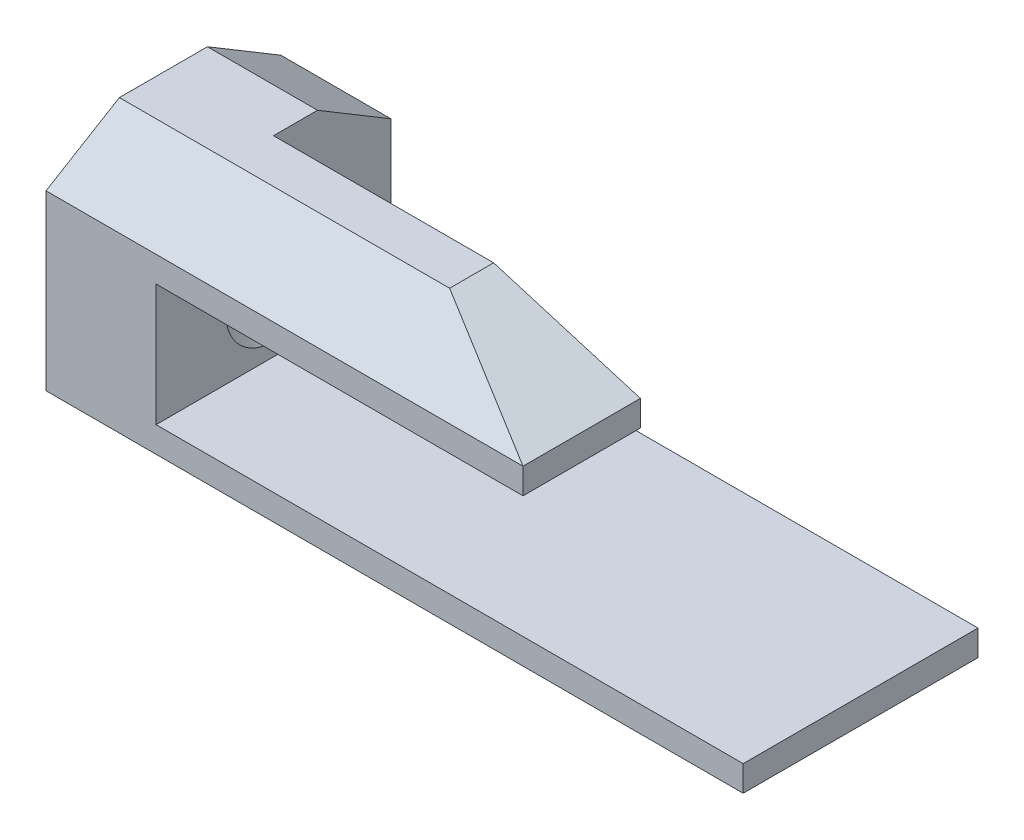
ISO-10303-21;
HEADER;
FILE_DESCRIPTION(('STEP AP214'),'2;1');
FILE_NAME('part.step','',(''),(''),'','','');
FILE_SCHEMA(('AUTOMOTIVE_DESIGN { 1 0 10303 214 1 1 1 1 }'));
ENDSEC;
DATA;
#1=APPLICATION_CONTEXT('core data for automotive mechanical design processes');
#2=APPLICATION_PROTOCOL_DEFINITION('international standard','automotive_design',2000,#1);
#3=PRODUCT_CONTEXT('',#1,'mechanical');
#4=PRODUCT('Part','Part','',(#3));
#5=PRODUCT_RELATED_PRODUCT_CATEGORY('part','',(#4));
#6=PRODUCT_DEFINITION_FORMATION('','',#4);
#7=PRODUCT_DEFINITION_CONTEXT('part definition',#1,'design');
#8=PRODUCT_DEFINITION('design','',#6,#7);
#9=PRODUCT_DEFINITION_SHAPE('','',#8);
#10=(LENGTH_UNIT() NAMED_UNIT(*) SI_UNIT(.MILLI.,.METRE.));
#11=(NAMED_UNIT(*) PLANE_ANGLE_UNIT() SI_UNIT($,.RADIAN.));
#12=(NAMED_UNIT(*) SI_UNIT($,.STERADIAN.) SOLID_ANGLE_UNIT());
#13=UNCERTAINTY_MEASURE_WITH_UNIT(LENGTH_MEASURE(1.E-05),#10,'distance_accuracy_value','');
#14=(GEOMETRIC_REPRESENTATION_CONTEXT(3) GLOBAL_UNCERTAINTY_ASSIGNED_CONTEXT((#13)) GLOBAL_UNIT_ASSIGNED_CONTEXT((#10,
#11,#12)) REPRESENTATION_CONTEXT('',''));
#15=CARTESIAN_POINT('',(0.,0.,0.));
#16=DIRECTION('',(0.,0.,1.));
#17=DIRECTION('',(1.,0.,0.));
#18=AXIS2_PLACEMENT_3D('',#15,#16,#17);
#19=CARTESIAN_POINT('',(0.,0.,0.));
#20=DIRECTION('',(0.,0.,-1.));
#21=DIRECTION('',(-1.,0.,0.));
#22=AXIS2_PLACEMENT_3D('',#19,#20,#21);
#23=PLANE('',#22);
#24=DIRECTION('',(1.,0.,0.));
#25=VECTOR('',#24,1.);
#26=CARTESIAN_POINT('',(0.,-26.1,0.));
#27=LINE('',#26,#25);
#28=CARTESIAN_POINT('',(0.,-26.1,0.));
#29=VERTEX_POINT('',#28);
#30=CARTESIAN_POINT('',(95.,-26.1,0.));
#31=VERTEX_POINT('',#30);
#32=EDGE_CURVE('E194',#29,#31,#27,.T.);
#33=ORIENTED_EDGE('',*,*,#32,.F.);
#34=DIRECTION('',(0.,-1.,0.));
#35=VECTOR('',#34,1.);
#36=CARTESIAN_POINT('',(0.,-28.6,0.));
#37=LINE('',#36,#35);
#38=CARTESIAN_POINT('',(0.,-2.5,0.));
#39=VERTEX_POINT('',#38);
#40=EDGE_CURVE('E246',#39,#29,#37,.T.);
#41=ORIENTED_EDGE('',*,*,#40,.F.);
#42=DIRECTION('',(-1.,0.,0.));
#43=VECTOR('',#42,1.);
#44=CARTESIAN_POINT('',(0.,-2.5,0.));
#45=LINE('',#44,#43);
#46=CARTESIAN_POINT('',(15.,-2.5,0.));
#47=VERTEX_POINT('',#46);
#48=EDGE_CURVE('E188',#47,#39,#45,.T.);
#49=ORIENTED_EDGE('',*,*,#48,.F.);
#50=DIRECTION('',(0.,1.,0.));
#51=VECTOR('',#50,1.);
#52=CARTESIAN_POINT('',(15.,-5.99999999999999,0.));
#53=LINE('',#52,#51);
#54=CARTESIAN_POINT('',(15.,-22.6,0.));
#55=VERTEX_POINT('',#54);
#56=EDGE_CURVE('E256',#55,#47,#53,.T.);
#57=ORIENTED_EDGE('',*,*,#56,.F.);
#58=DIRECTION('',(-1.,0.,0.));
#59=VECTOR('',#58,1.);
#60=CARTESIAN_POINT('',(15.,-22.6,0.));
#61=LINE('',#60,#59);
#62=CARTESIAN_POINT('',(95.,-22.6,0.));
#63=VERTEX_POINT('',#62);
#64=EDGE_CURVE('E267',#63,#55,#61,.T.);
#65=ORIENTED_EDGE('',*,*,#64,.F.);
#66=DIRECTION('',(0.,1.,0.));
#67=VECTOR('',#66,1.);
#68=CARTESIAN_POINT('',(95.,-22.6,0.));
#69=LINE('',#68,#67);
#70=EDGE_CURVE('E265',#31,#63,#69,.T.);
#71=ORIENTED_EDGE('',*,*,#70,.F.);
#72=EDGE_LOOP('',(#33,#41,#49,#57,#65,#71));
#73=FACE_BOUND('',#72,.T.);
#74=ADVANCED_FACE('F35',(#73),#23,.T.);
#75=CARTESIAN_POINT('',(8.0537780052751,0.,16.));
#76=DIRECTION('',(0.,0.,-1.));
#77=DIRECTION('',(-1.,0.,0.));
#78=AXIS2_PLACEMENT_3D('',#75,#76,#77);
#79=PLANE('',#78);
#80=DIRECTION('',(-0.957826285221151,0.287347885566345,0.));
#81=VECTOR('',#80,1.);
#82=CARTESIAN_POINT('',(12.0676862433716,13.3796941269885,16.));
#83=LINE('',#82,#81);
#84=CARTESIAN_POINT('',(65.,-2.5,16.));
#85=VERTEX_POINT('',#84);
#86=CARTESIAN_POINT('',(45.,3.5,16.));
#87=VERTEX_POINT('',#86);
#88=EDGE_CURVE('E172',#85,#87,#83,.T.);
#89=ORIENTED_EDGE('',*,*,#88,.F.);
#90=DIRECTION('',(0.,1.,0.));
#91=VECTOR('',#90,1.);
#92=CARTESIAN_POINT('',(65.,0.,16.));
#93=LINE('',#92,#91);
#94=CARTESIAN_POINT('',(65.,-5.99999999999999,16.));
#95=VERTEX_POINT('',#94);
#96=EDGE_CURVE('E171',#95,#85,#93,.T.);
#97=ORIENTED_EDGE('',*,*,#96,.F.);
#98=DIRECTION('',(1.,0.,0.));
#99=VECTOR('',#98,1.);
#100=CARTESIAN_POINT('',(-2.08800749063506,-5.99999999999999,16.));
#101=LINE('',#100,#99);
#102=CARTESIAN_POINT('',(15.,-5.99999999999999,16.));
#103=VERTEX_POINT('',#102);
#104=EDGE_CURVE('E211',#103,#95,#101,.T.);
#105=ORIENTED_EDGE('',*,*,#104,.F.);
#106=DIRECTION('',(0.,-1.,0.));
#107=VECTOR('',#106,1.);
#108=CARTESIAN_POINT('',(15.,0.,16.));
#109=LINE('',#108,#107);
#110=CARTESIAN_POINT('',(15.,3.50000000000001,16.));
#111=VERTEX_POINT('',#110);
#112=EDGE_CURVE('E59',#111,#103,#109,.T.);
#113=ORIENTED_EDGE('',*,*,#112,.F.);
#114=DIRECTION('',(1.,0.,0.));
#115=VECTOR('',#114,1.);
#116=CARTESIAN_POINT('',(8.0537780052751,3.50000000000001,16.));
#117=LINE('',#116,#115);
#118=EDGE_CURVE('E217',#111,#87,#117,.T.);
#119=ORIENTED_EDGE('',*,*,#118,.T.);
#120=EDGE_LOOP('',(#89,#97,#105,#113,#119));
#121=FACE_BOUND('',#120,.T.);
#122=ADVANCED_FACE('F326',(#121),#79,.T.);
#123=CARTESIAN_POINT('',(0.,-28.6,32.));
#124=DIRECTION('',(1.,0.,0.));
#125=DIRECTION('',(0.,0.,-1.));
#126=AXIS2_PLACEMENT_3D('',#123,#124,#125);
#127=PLANE('',#126);
#128=DIRECTION('',(0.,0.,1.));
#129=VECTOR('',#128,1.);
#130=CARTESIAN_POINT('',(0.,3.5,16.));
#131=LINE('',#130,#129);
#132=CARTESIAN_POINT('',(0.,3.5,10.));
#133=VERTEX_POINT('',#132);
#134=CARTESIAN_POINT('',(0.,3.5,22.));
#135=VERTEX_POINT('',#134);
#136=EDGE_CURVE('E208',#133,#135,#131,.T.);
#137=ORIENTED_EDGE('',*,*,#136,.F.);
#138=DIRECTION('',(0.,-0.514495755427527,-0.857492925712544));
#139=VECTOR('',#138,1.);
#140=CARTESIAN_POINT('',(0.,-2.5,0.));
#141=LINE('',#140,#139);
#142=EDGE_CURVE('E373',#133,#39,#141,.T.);
#143=ORIENTED_EDGE('',*,*,#142,.T.);
#144=ORIENTED_EDGE('',*,*,#40,.T.);
#145=DIRECTION('',(0.,-0.514495755427526,0.857492925712544));
#146=VECTOR('',#145,1.);
#147=CARTESIAN_POINT('',(0.,-26.1,0.));
#148=LINE('',#147,#146);
#149=CARTESIAN_POINT('',(0.,-32.1,10.));
#150=VERTEX_POINT('',#149);
#151=EDGE_CURVE('E384',#29,#150,#148,.T.);
#152=ORIENTED_EDGE('',*,*,#151,.T.);
#153=DIRECTION('',(0.,0.,-1.));
#154=VECTOR('',#153,1.);
#155=CARTESIAN_POINT('',(0.,-32.1,0.));
#156=LINE('',#155,#154);
#157=CARTESIAN_POINT('',(0.,-32.1,22.));
#158=VERTEX_POINT('',#157);
#159=EDGE_CURVE('E187',#158,#150,#156,.T.);
#160=ORIENTED_EDGE('',*,*,#159,.F.);
#161=DIRECTION('',(0.,0.514495755427526,0.857492925712544));
#162=VECTOR('',#161,1.);
#163=CARTESIAN_POINT('',(0.,-32.1,22.));
#164=LINE('',#163,#162);
#165=CARTESIAN_POINT('',(0.,-26.1,32.));
#166=VERTEX_POINT('',#165);
#167=EDGE_CURVE('E375',#158,#166,#164,.T.);
#168=ORIENTED_EDGE('',*,*,#167,.T.);
#169=DIRECTION('',(0.,-1.,0.));
#170=VECTOR('',#169,1.);
#171=CARTESIAN_POINT('',(0.,-28.6,32.));
#172=LINE('',#171,#170);
#173=CARTESIAN_POINT('',(0.,-2.5,32.));
#174=VERTEX_POINT('',#173);
#175=EDGE_CURVE('E253',#174,#166,#172,.T.);
#176=ORIENTED_EDGE('',*,*,#175,.F.);
#177=DIRECTION('',(0.,0.514495755427527,-0.857492925712544));
#178=VECTOR('',#177,1.);
#179=CARTESIAN_POINT('',(0.,3.5,22.));
#180=LINE('',#179,#178);
#181=EDGE_CURVE('E186',#174,#135,#180,.T.);
#182=ORIENTED_EDGE('',*,*,#181,.T.);
#183=EDGE_LOOP('',(#137,#143,#144,#152,#160,#168,#176,#182));
#184=FACE_BOUND('',#183,.T.);
#185=DIRECTION('',(0.,-0.707106781186547,0.707106781186547));
#186=VECTOR('',#185,1.);
#187=CARTESIAN_POINT('',(0.,-14.3,5.3933982822018));
#188=LINE('',#187,#186);
#189=CARTESIAN_POINT('',(0.,-14.3,5.39339828220179));
#190=VERTEX_POINT('',#189);
#191=CARTESIAN_POINT('',(0.,-24.9066017177982,16.));
#192=VERTEX_POINT('',#191);
#193=EDGE_CURVE('E236',#190,#192,#188,.T.);
#194=ORIENTED_EDGE('',*,*,#193,.F.);
#195=DIRECTION('',(0.,-0.707106781186547,-0.707106781186548));
#196=VECTOR('',#195,1.);
#197=CARTESIAN_POINT('',(0.,-3.6933982822018,16.));
#198=LINE('',#197,#196);
#199=CARTESIAN_POINT('',(0.,-3.6933982822018,16.));
#200=VERTEX_POINT('',#199);
#201=EDGE_CURVE('E234',#200,#190,#198,.T.);
#202=ORIENTED_EDGE('',*,*,#201,.F.);
#203=DIRECTION('',(0.,0.707106781186548,-0.707106781186547));
#204=VECTOR('',#203,1.);
#205=CARTESIAN_POINT('',(0.,-14.3,26.6066017177982));
#206=LINE('',#205,#204);
#207=CARTESIAN_POINT('',(0.,-14.3,26.6066017177982));
#208=VERTEX_POINT('',#207);
#209=EDGE_CURVE('E224',#208,#200,#206,.T.);
#210=ORIENTED_EDGE('',*,*,#209,.F.);
#211=DIRECTION('',(0.,0.707106781186547,0.707106781186547));
#212=VECTOR('',#211,1.);
#213=CARTESIAN_POINT('',(0.,-24.9066017177982,16.));
#214=LINE('',#213,#212);
#215=EDGE_CURVE('E239',#192,#208,#214,.T.);
#216=ORIENTED_EDGE('',*,*,#215,.F.);
#217=EDGE_LOOP('',(#194,#202,#210,#216));
#218=FACE_BOUND('',#217,.T.);
#219=ADVANCED_FACE('F323',(#184,#218),#127,.F.);
#220=CARTESIAN_POINT('',(95.,-22.6,32.));
#221=DIRECTION('',(-1.,0.,0.));
#222=DIRECTION('',(0.,0.,1.));
#223=AXIS2_PLACEMENT_3D('',#220,#221,#222);
#224=PLANE('',#223);
#225=DIRECTION('',(0.,1.,0.));
#226=VECTOR('',#225,1.);
#227=CARTESIAN_POINT('',(95.,-22.6,32.));
#228=LINE('',#227,#226);
#229=CARTESIAN_POINT('',(95.,-26.1,32.));
#230=VERTEX_POINT('',#229);
#231=CARTESIAN_POINT('',(95.,-22.6,32.));
#232=VERTEX_POINT('',#231);
#233=EDGE_CURVE('E255',#230,#232,#228,.T.);
#234=ORIENTED_EDGE('',*,*,#233,.F.);
#235=DIRECTION('',(0.,0.,1.));
#236=VECTOR('',#235,1.);
#237=CARTESIAN_POINT('',(95.,-26.1,-20.8806130178211));
#238=LINE('',#237,#236);
#239=EDGE_CURVE('E405',#31,#230,#238,.T.);
#240=ORIENTED_EDGE('',*,*,#239,.F.);
#241=ORIENTED_EDGE('',*,*,#70,.T.);
#242=DIRECTION('',(0.,0.,-1.));
#243=VECTOR('',#242,1.);
#244=CARTESIAN_POINT('',(95.,-22.6,32.));
#245=LINE('',#244,#243);
#246=EDGE_CURVE('E277',#232,#63,#245,.T.);
#247=ORIENTED_EDGE('',*,*,#246,.F.);
#248=EDGE_LOOP('',(#234,#240,#241,#247));
#249=FACE_BOUND('',#248,.T.);
#250=ADVANCED_FACE('F325',(#249),#224,.F.);
#251=CARTESIAN_POINT('',(15.,-22.6,32.));
#252=DIRECTION('',(0.,-1.,0.));
#253=DIRECTION('',(0.,0.,-1.));
#254=AXIS2_PLACEMENT_3D('',#251,#252,#253);
#255=PLANE('',#254);
#256=ORIENTED_EDGE('',*,*,#64,.T.);
#257=DIRECTION('',(0.,0.,-1.));
#258=VECTOR('',#257,1.);
#259=CARTESIAN_POINT('',(15.,-22.6,32.));
#260=LINE('',#259,#258);
#261=CARTESIAN_POINT('',(15.,-22.6,32.));
#262=VERTEX_POINT('',#261);
#263=EDGE_CURVE('E274',#262,#55,#260,.T.);
#264=ORIENTED_EDGE('',*,*,#263,.F.);
#265=DIRECTION('',(-1.,0.,0.));
#266=VECTOR('',#265,1.);
#267=CARTESIAN_POINT('',(15.,-22.6,32.));
#268=LINE('',#267,#266);
#269=EDGE_CURVE('E258',#232,#262,#268,.T.);
#270=ORIENTED_EDGE('',*,*,#269,.F.);
#271=ORIENTED_EDGE('',*,*,#246,.T.);
#272=EDGE_LOOP('',(#256,#264,#270,#271));
#273=FACE_BOUND('',#272,.T.);
#274=ADVANCED_FACE('F332',(#273),#255,.F.);
#275=CARTESIAN_POINT('',(15.,-5.99999999999999,32.));
#276=DIRECTION('',(-1.,0.,0.));
#277=DIRECTION('',(0.,-1.,0.));
#278=AXIS2_PLACEMENT_3D('',#275,#276,#277);
#279=PLANE('',#278);
#280=CARTESIAN_POINT('',(15.,-14.3,16.));
#281=DIRECTION('',(-1.,0.,0.));
#282=DIRECTION('',(0.,-1.,0.));
#283=AXIS2_PLACEMENT_3D('',#280,#281,#282);
#284=CIRCLE('',#283,6.50000000000002);
#285=CARTESIAN_POINT('',(15.,-20.8,16.));
#286=VERTEX_POINT('',#285);
#287=EDGE_CURVE('E163',#286,#286,#284,.T.);
#288=ORIENTED_EDGE('',*,*,#287,.T.);
#289=EDGE_LOOP('',(#288));
#290=FACE_BOUND('',#289,.T.);
#291=ORIENTED_EDGE('',*,*,#56,.T.);
#292=DIRECTION('',(0.,0.514495755427527,0.857492925712544));
#293=VECTOR('',#292,1.);
#294=CARTESIAN_POINT('',(15.,-2.5,0.));
#295=LINE('',#294,#293);
#296=CARTESIAN_POINT('',(15.,3.5,10.));
#297=VERTEX_POINT('',#296);
#298=EDGE_CURVE('E370',#47,#297,#295,.T.);
#299=ORIENTED_EDGE('',*,*,#298,.T.);
#300=DIRECTION('',(0.,0.,1.));
#301=VECTOR('',#300,1.);
#302=CARTESIAN_POINT('',(15.,3.5,10.));
#303=LINE('',#302,#301);
#304=EDGE_CURVE('E206',#297,#111,#303,.T.);
#305=ORIENTED_EDGE('',*,*,#304,.T.);
#306=ORIENTED_EDGE('',*,*,#112,.T.);
#307=DIRECTION('',(0.,0.,-1.));
#308=VECTOR('',#307,1.);
#309=CARTESIAN_POINT('',(15.,-5.99999999999999,32.));
#310=LINE('',#309,#308);
#311=CARTESIAN_POINT('',(15.,-5.99999999999999,32.));
#312=VERTEX_POINT('',#311);
#313=EDGE_CURVE('E271',#312,#103,#310,.T.);
#314=ORIENTED_EDGE('',*,*,#313,.F.);
#315=DIRECTION('',(0.,1.,0.));
#316=VECTOR('',#315,1.);
#317=CARTESIAN_POINT('',(15.,-5.99999999999999,32.));
#318=LINE('',#317,#316);
#319=EDGE_CURVE('E260',#262,#312,#318,.T.);
#320=ORIENTED_EDGE('',*,*,#319,.F.);
#321=ORIENTED_EDGE('',*,*,#263,.T.);
#322=EDGE_LOOP('',(#291,#299,#305,#306,#314,#320,#321));
#323=FACE_BOUND('',#322,.T.);
#324=ADVANCED_FACE('F288',(#290,#323),#279,.F.);
#325=CARTESIAN_POINT('',(65.,-5.99999999999999,32.));
#326=DIRECTION('',(0.,1.,0.));
#327=DIRECTION('',(0.,0.,1.));
#328=AXIS2_PLACEMENT_3D('',#325,#326,#327);
#329=PLANE('',#328);
#330=ORIENTED_EDGE('',*,*,#313,.T.);
#331=ORIENTED_EDGE('',*,*,#104,.T.);
#332=DIRECTION('',(0.,0.,-1.));
#333=VECTOR('',#332,1.);
#334=CARTESIAN_POINT('',(65.,-5.99999999999999,32.));
#335=LINE('',#334,#333);
#336=CARTESIAN_POINT('',(65.,-5.99999999999999,32.));
#337=VERTEX_POINT('',#336);
#338=EDGE_CURVE('E181',#337,#95,#335,.T.);
#339=ORIENTED_EDGE('',*,*,#338,.F.);
#340=DIRECTION('',(1.,0.,0.));
#341=VECTOR('',#340,1.);
#342=CARTESIAN_POINT('',(65.,-5.99999999999999,32.));
#343=LINE('',#342,#341);
#344=EDGE_CURVE('E179',#312,#337,#343,.T.);
#345=ORIENTED_EDGE('',*,*,#344,.F.);
#346=EDGE_LOOP('',(#330,#331,#339,#345));
#347=FACE_BOUND('',#346,.T.);
#348=ADVANCED_FACE('F346',(#347),#329,.F.);
#349=CARTESIAN_POINT('',(65.,0.,32.));
#350=DIRECTION('',(-1.,0.,0.));
#351=DIRECTION('',(0.,0.,1.));
#352=AXIS2_PLACEMENT_3D('',#349,#350,#351);
#353=PLANE('',#352);
#354=ORIENTED_EDGE('',*,*,#96,.T.);
#355=DIRECTION('',(0.,0.,1.));
#356=VECTOR('',#355,1.);
#357=CARTESIAN_POINT('',(65.,-2.5,-20.8806130178211));
#358=LINE('',#357,#356);
#359=CARTESIAN_POINT('',(65.,-2.5,32.));
#360=VERTEX_POINT('',#359);
#361=EDGE_CURVE('E157',#85,#360,#358,.T.);
#362=ORIENTED_EDGE('',*,*,#361,.T.);
#363=DIRECTION('',(0.,1.,0.));
#364=VECTOR('',#363,1.);
#365=CARTESIAN_POINT('',(65.,0.,32.));
#366=LINE('',#365,#364);
#367=EDGE_CURVE('E170',#337,#360,#366,.T.);
#368=ORIENTED_EDGE('',*,*,#367,.F.);
#369=ORIENTED_EDGE('',*,*,#338,.T.);
#370=EDGE_LOOP('',(#354,#362,#368,#369));
#371=FACE_BOUND('',#370,.T.);
#372=ADVANCED_FACE('F168',(#371),#353,.F.);
#373=CARTESIAN_POINT('',(0.,0.,32.));
#374=DIRECTION('',(0.,0.,-1.));
#375=DIRECTION('',(-1.,0.,0.));
#376=AXIS2_PLACEMENT_3D('',#373,#374,#375);
#377=PLANE('',#376);
#378=ORIENTED_EDGE('',*,*,#175,.T.);
#379=DIRECTION('',(-1.,0.,0.));
#380=VECTOR('',#379,1.);
#381=CARTESIAN_POINT('',(0.,-26.1,32.));
#382=LINE('',#381,#380);
#383=EDGE_CURVE('E197',#230,#166,#382,.T.);
#384=ORIENTED_EDGE('',*,*,#383,.F.);
#385=ORIENTED_EDGE('',*,*,#233,.T.);
#386=ORIENTED_EDGE('',*,*,#269,.T.);
#387=ORIENTED_EDGE('',*,*,#319,.T.);
#388=ORIENTED_EDGE('',*,*,#344,.T.);
#389=ORIENTED_EDGE('',*,*,#367,.T.);
#390=DIRECTION('',(1.,0.,0.));
#391=VECTOR('',#390,1.);
#392=CARTESIAN_POINT('',(0.,-2.5,32.));
#393=LINE('',#392,#391);
#394=EDGE_CURVE('E176',#174,#360,#393,.T.);
#395=ORIENTED_EDGE('',*,*,#394,.F.);
#396=EDGE_LOOP('',(#378,#384,#385,#386,#387,#388,#389,#395));
#397=FACE_BOUND('',#396,.T.);
#398=ADVANCED_FACE('F175',(#397),#377,.F.);
#399=CARTESIAN_POINT('',(3.,-3.6933982822018,16.));
#400=DIRECTION('',(0.,0.707106781186548,-0.707106781186547));
#401=DIRECTION('',(0.,0.707106781186547,0.707106781186548));
#402=AXIS2_PLACEMENT_3D('',#399,#400,#401);
#403=PLANE('',#402);
#404=ORIENTED_EDGE('',*,*,#201,.T.);
#405=DIRECTION('',(-1.,0.,0.));
#406=VECTOR('',#405,1.);
#407=CARTESIAN_POINT('',(3.,-14.3,5.3933982822018));
#408=LINE('',#407,#406);
#409=CARTESIAN_POINT('',(3.,-14.3,5.3933982822018));
#410=VERTEX_POINT('',#409);
#411=EDGE_CURVE('E233',#410,#190,#408,.T.);
#412=ORIENTED_EDGE('',*,*,#411,.F.);
#413=DIRECTION('',(0.,-0.707106781186547,-0.707106781186548));
#414=VECTOR('',#413,1.);
#415=CARTESIAN_POINT('',(3.,-3.6933982822018,16.));
#416=LINE('',#415,#414);
#417=CARTESIAN_POINT('',(3.,-3.6933982822018,16.));
#418=VERTEX_POINT('',#417);
#419=EDGE_CURVE('E220',#418,#410,#416,.T.);
#420=ORIENTED_EDGE('',*,*,#419,.F.);
#421=DIRECTION('',(-1.,0.,0.));
#422=VECTOR('',#421,1.);
#423=CARTESIAN_POINT('',(3.,-3.6933982822018,16.));
#424=LINE('',#423,#422);
#425=EDGE_CURVE('E244',#418,#200,#424,.T.);
#426=ORIENTED_EDGE('',*,*,#425,.T.);
#427=EDGE_LOOP('',(#404,#412,#420,#426));
#428=FACE_BOUND('',#427,.T.);
#429=ADVANCED_FACE('F311',(#428),#403,.F.);
#430=CARTESIAN_POINT('',(3.,-14.3,26.6066017177982));
#431=DIRECTION('',(0.,0.707106781186547,0.707106781186548));
#432=DIRECTION('',(0.,-0.707106781186548,0.707106781186547));
#433=AXIS2_PLACEMENT_3D('',#430,#431,#432);
#434=PLANE('',#433);
#435=ORIENTED_EDGE('',*,*,#209,.T.);
#436=ORIENTED_EDGE('',*,*,#425,.F.);
#437=DIRECTION('',(0.,0.707106781186548,-0.707106781186547));
#438=VECTOR('',#437,1.);
#439=CARTESIAN_POINT('',(3.,-14.3,26.6066017177982));
#440=LINE('',#439,#438);
#441=CARTESIAN_POINT('',(3.,-14.3,26.6066017177982));
#442=VERTEX_POINT('',#441);
#443=EDGE_CURVE('E230',#442,#418,#440,.T.);
#444=ORIENTED_EDGE('',*,*,#443,.F.);
#445=DIRECTION('',(-1.,0.,0.));
#446=VECTOR('',#445,1.);
#447=CARTESIAN_POINT('',(3.,-14.3,26.6066017177982));
#448=LINE('',#447,#446);
#449=EDGE_CURVE('E247',#442,#208,#448,.T.);
#450=ORIENTED_EDGE('',*,*,#449,.T.);
#451=EDGE_LOOP('',(#435,#436,#444,#450));
#452=FACE_BOUND('',#451,.T.);
#453=ADVANCED_FACE('F320',(#452),#434,.F.);
#454=CARTESIAN_POINT('',(3.,-24.9066017177982,16.));
#455=DIRECTION('',(0.,-0.707106781186547,0.707106781186548));
#456=DIRECTION('',(0.,-0.707106781186548,-0.707106781186547));
#457=AXIS2_PLACEMENT_3D('',#454,#455,#456);
#458=PLANE('',#457);
#459=ORIENTED_EDGE('',*,*,#215,.T.);
#460=ORIENTED_EDGE('',*,*,#449,.F.);
#461=DIRECTION('',(0.,0.707106781186547,0.707106781186547));
#462=VECTOR('',#461,1.);
#463=CARTESIAN_POINT('',(3.,-24.9066017177982,16.));
#464=LINE('',#463,#462);
#465=CARTESIAN_POINT('',(3.,-24.9066017177982,16.));
#466=VERTEX_POINT('',#465);
#467=EDGE_CURVE('E227',#466,#442,#464,.T.);
#468=ORIENTED_EDGE('',*,*,#467,.F.);
#469=DIRECTION('',(-1.,0.,0.));
#470=VECTOR('',#469,1.);
#471=CARTESIAN_POINT('',(3.,-24.9066017177982,16.));
#472=LINE('',#471,#470);
#473=EDGE_CURVE('E249',#466,#192,#472,.T.);
#474=ORIENTED_EDGE('',*,*,#473,.T.);
#475=EDGE_LOOP('',(#459,#460,#468,#474));
#476=FACE_BOUND('',#475,.T.);
#477=ADVANCED_FACE('F318',(#476),#458,.F.);
#478=CARTESIAN_POINT('',(3.,-14.3,5.3933982822018));
#479=DIRECTION('',(0.,-0.707106781186547,-0.707106781186548));
#480=DIRECTION('',(0.,0.707106781186548,-0.707106781186547));
#481=AXIS2_PLACEMENT_3D('',#478,#479,#480);
#482=PLANE('',#481);
#483=ORIENTED_EDGE('',*,*,#193,.T.);
#484=ORIENTED_EDGE('',*,*,#473,.F.);
#485=DIRECTION('',(0.,-0.707106781186547,0.707106781186547));
#486=VECTOR('',#485,1.);
#487=CARTESIAN_POINT('',(3.,-14.3,5.3933982822018));
#488=LINE('',#487,#486);
#489=EDGE_CURVE('E223',#410,#466,#488,.T.);
#490=ORIENTED_EDGE('',*,*,#489,.F.);
#491=ORIENTED_EDGE('',*,*,#411,.T.);
#492=EDGE_LOOP('',(#483,#484,#490,#491));
#493=FACE_BOUND('',#492,.T.);
#494=ADVANCED_FACE('F305',(#493),#482,.F.);
#495=CARTESIAN_POINT('',(3.,0.,0.));
#496=DIRECTION('',(-1.,0.,0.));
#497=DIRECTION('',(0.,-1.,0.));
#498=AXIS2_PLACEMENT_3D('',#495,#496,#497);
#499=PLANE('',#498);
#500=CARTESIAN_POINT('',(3.,-14.3,16.));
#501=DIRECTION('',(-1.,0.,0.));
#502=DIRECTION('',(0.,-1.,0.));
#503=AXIS2_PLACEMENT_3D('',#500,#501,#502);
#504=CIRCLE('',#503,2.5);
#505=CARTESIAN_POINT('',(3.,-16.8,16.));
#506=VERTEX_POINT('',#505);
#507=EDGE_CURVE('E219',#506,#506,#504,.T.);
#508=ORIENTED_EDGE('',*,*,#507,.F.);
#509=EDGE_LOOP('',(#508));
#510=FACE_BOUND('',#509,.T.);
#511=ORIENTED_EDGE('',*,*,#419,.T.);
#512=ORIENTED_EDGE('',*,*,#489,.T.);
#513=ORIENTED_EDGE('',*,*,#467,.T.);
#514=ORIENTED_EDGE('',*,*,#443,.T.);
#515=EDGE_LOOP('',(#511,#512,#513,#514));
#516=FACE_BOUND('',#515,.T.);
#517=ADVANCED_FACE('F299',(#510,#516),#499,.T.);
#518=CARTESIAN_POINT('',(22.0710678118655,-14.3,16.));
#519=DIRECTION('',(-1.,0.,0.));
#520=DIRECTION('',(0.,-1.,0.));
#521=AXIS2_PLACEMENT_3D('',#518,#519,#520);
#522=CYLINDRICAL_SURFACE('',#521,2.5);
#523=CARTESIAN_POINT('',(11.,-14.3,16.));
#524=DIRECTION('',(-1.,0.,0.));
#525=DIRECTION('',(0.,0.,1.));
#526=AXIS2_PLACEMENT_3D('',#523,#524,#525);
#527=CIRCLE('',#526,2.5);
#528=CARTESIAN_POINT('',(11.,-14.3,18.5));
#529=VERTEX_POINT('',#528);
#530=EDGE_CURVE('E280',#529,#529,#527,.F.);
#531=ORIENTED_EDGE('',*,*,#530,.T.);
#532=EDGE_LOOP('',(#531));
#533=FACE_BOUND('',#532,.T.);
#534=ORIENTED_EDGE('',*,*,#507,.T.);
#535=EDGE_LOOP('',(#534));
#536=FACE_BOUND('',#535,.T.);
#537=ADVANCED_FACE('F294',(#533,#536),#522,.F.);
#538=CARTESIAN_POINT('',(11.,-14.3,16.));
#539=DIRECTION('',(1.,0.,0.));
#540=DIRECTION('',(0.,0.,-1.));
#541=AXIS2_PLACEMENT_3D('',#538,#539,#540);
#542=CONICAL_SURFACE('',#541,2.5,0.78539816339745);
#543=ORIENTED_EDGE('',*,*,#287,.F.);
#544=EDGE_LOOP('',(#543));
#545=FACE_BOUND('',#544,.T.);
#546=ORIENTED_EDGE('',*,*,#530,.F.);
#547=EDGE_LOOP('',(#546));
#548=FACE_BOUND('',#547,.T.);
#549=ADVANCED_FACE('F38',(#545,#548),#542,.F.);
#550=CARTESIAN_POINT('',(8.0537780052751,3.50000000000001,16.));
#551=DIRECTION('',(0.,1.,0.));
#552=DIRECTION('',(0.,0.,1.));
#553=AXIS2_PLACEMENT_3D('',#550,#551,#552);
#554=PLANE('',#553);
#555=DIRECTION('',(0.,0.,1.));
#556=VECTOR('',#555,1.);
#557=CARTESIAN_POINT('',(45.,3.5,-20.8806130178211));
#558=LINE('',#557,#556);
#559=CARTESIAN_POINT('',(45.,3.50000000000001,22.));
#560=VERTEX_POINT('',#559);
#561=EDGE_CURVE('E51',#87,#560,#558,.T.);
#562=ORIENTED_EDGE('',*,*,#561,.F.);
#563=ORIENTED_EDGE('',*,*,#118,.F.);
#564=ORIENTED_EDGE('',*,*,#304,.F.);
#565=DIRECTION('',(1.,0.,0.));
#566=VECTOR('',#565,1.);
#567=CARTESIAN_POINT('',(0.,3.5,10.));
#568=LINE('',#567,#566);
#569=EDGE_CURVE('E202',#133,#297,#568,.T.);
#570=ORIENTED_EDGE('',*,*,#569,.F.);
#571=ORIENTED_EDGE('',*,*,#136,.T.);
#572=DIRECTION('',(1.,0.,0.));
#573=VECTOR('',#572,1.);
#574=CARTESIAN_POINT('',(8.0537780052751,3.50000000000001,22.));
#575=LINE('',#574,#573);
#576=EDGE_CURVE('E215',#135,#560,#575,.T.);
#577=ORIENTED_EDGE('',*,*,#576,.T.);
#578=EDGE_LOOP('',(#562,#563,#564,#570,#571,#577));
#579=FACE_BOUND('',#578,.T.);
#580=ADVANCED_FACE('F293',(#579),#554,.T.);
#581=CARTESIAN_POINT('',(107.5,-32.1,0.));
#582=DIRECTION('',(0.,1.,0.));
#583=DIRECTION('',(0.,0.,1.));
#584=AXIS2_PLACEMENT_3D('',#581,#582,#583);
#585=PLANE('',#584);
#586=DIRECTION('',(-1.,0.,0.));
#587=VECTOR('',#586,1.);
#588=CARTESIAN_POINT('',(107.5,-32.1,10.));
#589=LINE('',#588,#587);
#590=CARTESIAN_POINT('',(75.,-32.1,10.));
#591=VERTEX_POINT('',#590);
#592=EDGE_CURVE('E191',#591,#150,#589,.T.);
#593=ORIENTED_EDGE('',*,*,#592,.F.);
#594=DIRECTION('',(0.,0.,1.));
#595=VECTOR('',#594,1.);
#596=CARTESIAN_POINT('',(75.,-32.1,-20.8806130178211));
#597=LINE('',#596,#595);
#598=CARTESIAN_POINT('',(75.,-32.1,22.));
#599=VERTEX_POINT('',#598);
#600=EDGE_CURVE('E403',#591,#599,#597,.T.);
#601=ORIENTED_EDGE('',*,*,#600,.T.);
#602=DIRECTION('',(-1.,0.,0.));
#603=VECTOR('',#602,1.);
#604=CARTESIAN_POINT('',(107.5,-32.1,22.));
#605=LINE('',#604,#603);
#606=EDGE_CURVE('E200',#599,#158,#605,.T.);
#607=ORIENTED_EDGE('',*,*,#606,.T.);
#608=ORIENTED_EDGE('',*,*,#159,.T.);
#609=EDGE_LOOP('',(#593,#601,#607,#608));
#610=FACE_BOUND('',#609,.T.);
#611=ADVANCED_FACE('F401',(#610),#585,.F.);
#612=CARTESIAN_POINT('',(106.661903789691,-26.1,0.));
#613=DIRECTION('',(0.,-0.857492925712544,-0.514495755427526));
#614=DIRECTION('',(0.,0.514495755427526,-0.857492925712544));
#615=AXIS2_PLACEMENT_3D('',#612,#613,#614);
#616=PLANE('',#615);
#617=DIRECTION('',(0.86386842558136,0.259160527674408,-0.43193421279068));
#618=VECTOR('',#617,1.);
#619=CARTESIAN_POINT('',(103.702913275889,-23.4891260172335,-4.35145663794425));
#620=LINE('',#619,#618);
#621=EDGE_CURVE('E377',#591,#31,#620,.T.);
#622=ORIENTED_EDGE('',*,*,#621,.F.);
#623=ORIENTED_EDGE('',*,*,#592,.T.);
#624=ORIENTED_EDGE('',*,*,#151,.F.);
#625=ORIENTED_EDGE('',*,*,#32,.T.);
#626=EDGE_LOOP('',(#622,#623,#624,#625));
#627=FACE_BOUND('',#626,.T.);
#628=ADVANCED_FACE('F411',(#627),#616,.T.);
#629=CARTESIAN_POINT('',(106.661903789691,-32.1,22.));
#630=DIRECTION('',(0.,-0.857492925712544,0.514495755427526));
#631=DIRECTION('',(0.,-0.514495755427526,-0.857492925712544));
#632=AXIS2_PLACEMENT_3D('',#629,#630,#631);
#633=PLANE('',#632);
#634=DIRECTION('',(-0.86386842558136,-0.259160527674408,-0.43193421279068));
#635=VECTOR('',#634,1.);
#636=CARTESIAN_POINT('',(98.6282864102169,-25.0115140769349,33.8141432051084));
#637=LINE('',#636,#635);
#638=EDGE_CURVE('E11',#230,#599,#637,.T.);
#639=ORIENTED_EDGE('',*,*,#638,.F.);
#640=ORIENTED_EDGE('',*,*,#383,.T.);
#641=ORIENTED_EDGE('',*,*,#167,.F.);
#642=ORIENTED_EDGE('',*,*,#606,.F.);
#643=EDGE_LOOP('',(#639,#640,#641,#642));
#644=FACE_BOUND('',#643,.T.);
#645=ADVANCED_FACE('F395',(#644),#633,.T.);
#646=CARTESIAN_POINT('',(76.6619037896906,3.5,22.));
#647=DIRECTION('',(0.,0.857492925712544,0.514495755427527));
#648=DIRECTION('',(0.,-0.514495755427527,0.857492925712544));
#649=AXIS2_PLACEMENT_3D('',#646,#647,#648);
#650=PLANE('',#649);
#651=DIRECTION('',(0.86386842558136,-0.259160527674408,0.43193421279068));
#652=VECTOR('',#651,1.);
#653=CARTESIAN_POINT('',(68.6282864102169,-3.58848592306506,33.8141432051084));
#654=LINE('',#653,#652);
#655=EDGE_CURVE('E44',#560,#360,#654,.T.);
#656=ORIENTED_EDGE('',*,*,#655,.F.);
#657=ORIENTED_EDGE('',*,*,#576,.F.);
#658=ORIENTED_EDGE('',*,*,#181,.F.);
#659=ORIENTED_EDGE('',*,*,#394,.T.);
#660=EDGE_LOOP('',(#656,#657,#658,#659));
#661=FACE_BOUND('',#660,.T.);
#662=ADVANCED_FACE('F184',(#661),#650,.T.);
#663=CARTESIAN_POINT('',(26.6619037896906,-2.5,0.));
#664=DIRECTION('',(0.,0.857492925712544,-0.514495755427527));
#665=DIRECTION('',(0.,0.514495755427527,0.857492925712544));
#666=AXIS2_PLACEMENT_3D('',#663,#664,#665);
#667=PLANE('',#666);
#668=ORIENTED_EDGE('',*,*,#298,.F.);
#669=ORIENTED_EDGE('',*,*,#48,.T.);
#670=ORIENTED_EDGE('',*,*,#142,.F.);
#671=ORIENTED_EDGE('',*,*,#569,.T.);
#672=EDGE_LOOP('',(#668,#669,#670,#671));
#673=FACE_BOUND('',#672,.T.);
#674=ADVANCED_FACE('F371',(#673),#667,.T.);
#675=CARTESIAN_POINT('',(45.,3.5,-20.8806130178211));
#676=DIRECTION('',(-0.287347885566345,-0.957826285221151,0.));
#677=DIRECTION('',(0.957826285221151,-0.287347885566345,0.));
#678=AXIS2_PLACEMENT_3D('',#675,#676,#677);
#679=PLANE('',#678);
#680=ORIENTED_EDGE('',*,*,#88,.T.);
#681=ORIENTED_EDGE('',*,*,#561,.T.);
#682=ORIENTED_EDGE('',*,*,#655,.T.);
#683=ORIENTED_EDGE('',*,*,#361,.F.);
#684=EDGE_LOOP('',(#680,#681,#682,#683));
#685=FACE_BOUND('',#684,.T.);
#686=ADVANCED_FACE('F156',(#685),#679,.F.);
#687=CARTESIAN_POINT('',(75.,-32.1,-20.8806130178211));
#688=DIRECTION('',(-0.287347885566345,0.957826285221151,0.));
#689=DIRECTION('',(-0.957826285221151,-0.287347885566345,0.));
#690=AXIS2_PLACEMENT_3D('',#687,#688,#689);
#691=PLANE('',#690);
#692=ORIENTED_EDGE('',*,*,#621,.T.);
#693=ORIENTED_EDGE('',*,*,#239,.T.);
#694=ORIENTED_EDGE('',*,*,#638,.T.);
#695=ORIENTED_EDGE('',*,*,#600,.F.);
#696=EDGE_LOOP('',(#692,#693,#694,#695));
#697=FACE_BOUND('',#696,.T.);
#698=ADVANCED_FACE('F410',(#697),#691,.F.);
#699=CLOSED_SHELL('',(#74,#122,#219,#250,#274,#324,#348,#372,#398,#429,#453,#477,#494,#517,#537,
#549,#580,#611,#628,#645,#662,#674,#686,#698));
#700=MANIFOLD_SOLID_BREP('B2',#699);
#701=ADVANCED_BREP_SHAPE_REPRESENTATION('',(#18,#700),#14);
#702=SHAPE_DEFINITION_REPRESENTATION(#9,#701);
ENDSEC;
END-ISO-10303-21;
